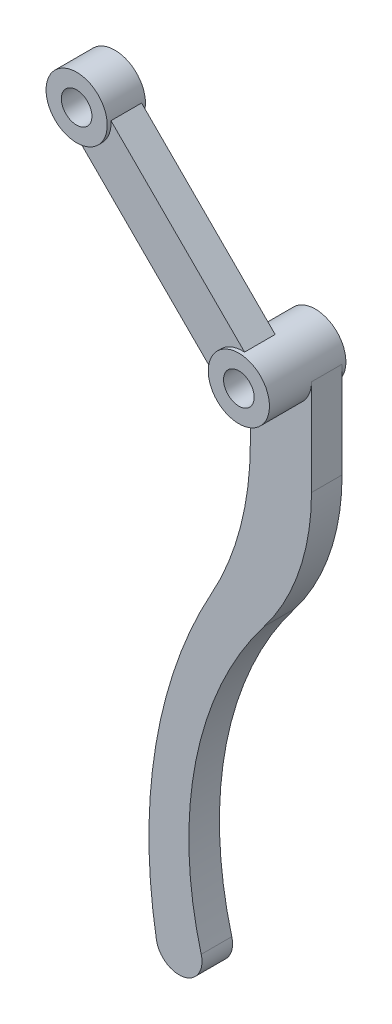
ISO-10303-21;
HEADER;
FILE_DESCRIPTION(('STEP AP214'),'2;1');
FILE_NAME('part.step','',(''),(''),'','','');
FILE_SCHEMA(('AUTOMOTIVE_DESIGN { 1 0 10303 214 1 1 1 1 }'));
ENDSEC;
DATA;
#1=APPLICATION_CONTEXT('core data for automotive mechanical design processes');
#2=APPLICATION_PROTOCOL_DEFINITION('international standard','automotive_design',2000,#1);
#3=PRODUCT_CONTEXT('',#1,'mechanical');
#4=PRODUCT('Part','Part','',(#3));
#5=PRODUCT_RELATED_PRODUCT_CATEGORY('part','',(#4));
#6=PRODUCT_DEFINITION_FORMATION('','',#4);
#7=PRODUCT_DEFINITION_CONTEXT('part definition',#1,'design');
#8=PRODUCT_DEFINITION('design','',#6,#7);
#9=PRODUCT_DEFINITION_SHAPE('','',#8);
#10=(LENGTH_UNIT() NAMED_UNIT(*) SI_UNIT(.MILLI.,.METRE.));
#11=(NAMED_UNIT(*) PLANE_ANGLE_UNIT() SI_UNIT($,.RADIAN.));
#12=(NAMED_UNIT(*) SI_UNIT($,.STERADIAN.) SOLID_ANGLE_UNIT());
#13=UNCERTAINTY_MEASURE_WITH_UNIT(LENGTH_MEASURE(1.E-05),#10,'distance_accuracy_value','');
#14=(GEOMETRIC_REPRESENTATION_CONTEXT(3) GLOBAL_UNCERTAINTY_ASSIGNED_CONTEXT((#13)) GLOBAL_UNIT_ASSIGNED_CONTEXT((#10,
#11,#12)) REPRESENTATION_CONTEXT('',''));
#15=CARTESIAN_POINT('',(0.,0.,0.));
#16=DIRECTION('',(0.,0.,1.));
#17=DIRECTION('',(1.,0.,0.));
#18=AXIS2_PLACEMENT_3D('',#15,#16,#17);
#19=CARTESIAN_POINT('',(0.,0.,10.));
#20=DIRECTION('',(0.,0.,-1.));
#21=DIRECTION('',(-1.,0.,0.));
#22=AXIS2_PLACEMENT_3D('',#19,#20,#21);
#23=CYLINDRICAL_SURFACE('',#22,8.);
#24=CARTESIAN_POINT('',(0.,0.,-10.));
#25=DIRECTION('',(0.,0.,1.));
#26=DIRECTION('',(1.,0.,0.));
#27=AXIS2_PLACEMENT_3D('',#24,#25,#26);
#28=CIRCLE('',#27,8.);
#29=CARTESIAN_POINT('',(8.,0.,-10.));
#30=VERTEX_POINT('',#29);
#31=EDGE_CURVE('E198',#30,#30,#28,.T.);
#32=ORIENTED_EDGE('',*,*,#31,.T.);
#33=EDGE_LOOP('',(#32));
#34=FACE_BOUND('',#33,.T.);
#35=CARTESIAN_POINT('',(0.,0.,10.));
#36=DIRECTION('',(0.,0.,1.));
#37=DIRECTION('',(1.,0.,0.));
#38=AXIS2_PLACEMENT_3D('',#35,#36,#37);
#39=CIRCLE('',#38,8.);
#40=CARTESIAN_POINT('',(8.,0.,10.));
#41=VERTEX_POINT('',#40);
#42=EDGE_CURVE('E11',#41,#41,#39,.T.);
#43=ORIENTED_EDGE('',*,*,#42,.F.);
#44=EDGE_LOOP('',(#43));
#45=FACE_BOUND('',#44,.T.);
#46=DIRECTION('',(0.,0.,-1.));
#47=VECTOR('',#46,1.);
#48=CARTESIAN_POINT('',(0.500983300345398,7.98429807389322,9.));
#49=LINE('',#48,#47);
#50=CARTESIAN_POINT('',(0.500983300345397,7.98429807389322,9.));
#51=VERTEX_POINT('',#50);
#52=CARTESIAN_POINT('',(0.500983300345398,7.98429807389322,0.999999999999999));
#53=VERTEX_POINT('',#52);
#54=EDGE_CURVE('E57',#51,#53,#49,.T.);
#55=ORIENTED_EDGE('',*,*,#54,.F.);
#56=CARTESIAN_POINT('',(0.,0.,9.));
#57=DIRECTION('',(0.,0.,-1.));
#58=DIRECTION('',(1.,0.,0.));
#59=AXIS2_PLACEMENT_3D('',#56,#57,#58);
#60=CIRCLE('',#59,8.);
#61=CARTESIAN_POINT('',(-7.98429807389323,-0.500983300345278,9.));
#62=VERTEX_POINT('',#61);
#63=EDGE_CURVE('E214',#62,#51,#60,.T.);
#64=ORIENTED_EDGE('',*,*,#63,.F.);
#65=DIRECTION('',(0.,0.,-1.));
#66=VECTOR('',#65,1.);
#67=CARTESIAN_POINT('',(-7.98429807389323,-0.500983300345287,9.));
#68=LINE('',#67,#66);
#69=CARTESIAN_POINT('',(-7.98429807389323,-0.500983300345287,1.));
#70=VERTEX_POINT('',#69);
#71=EDGE_CURVE('E225',#62,#70,#68,.T.);
#72=ORIENTED_EDGE('',*,*,#71,.T.);
#73=CARTESIAN_POINT('',(0.,0.,1.));
#74=DIRECTION('',(0.,0.,-1.));
#75=DIRECTION('',(1.,0.,0.));
#76=AXIS2_PLACEMENT_3D('',#73,#74,#75);
#77=CIRCLE('',#76,8.);
#78=EDGE_CURVE('E211',#70,#53,#77,.T.);
#79=ORIENTED_EDGE('',*,*,#78,.T.);
#80=EDGE_LOOP('',(#55,#64,#72,#79));
#81=FACE_BOUND('',#80,.T.);
#82=CARTESIAN_POINT('',(0.,0.,-9.));
#83=DIRECTION('',(0.,0.,-1.));
#84=DIRECTION('',(1.,0.,0.));
#85=AXIS2_PLACEMENT_3D('',#82,#83,#84);
#86=CIRCLE('',#85,8.);
#87=CARTESIAN_POINT('',(8.,0.,-9.));
#88=VERTEX_POINT('',#87);
#89=CARTESIAN_POINT('',(-8.,0.,-9.));
#90=VERTEX_POINT('',#89);
#91=EDGE_CURVE('E141',#88,#90,#86,.T.);
#92=ORIENTED_EDGE('',*,*,#91,.T.);
#93=DIRECTION('',(0.,0.,1.));
#94=VECTOR('',#93,1.);
#95=CARTESIAN_POINT('',(-8.,0.,-9.));
#96=LINE('',#95,#94);
#97=CARTESIAN_POINT('',(-8.,0.,-1.));
#98=VERTEX_POINT('',#97);
#99=EDGE_CURVE('E125',#90,#98,#96,.T.);
#100=ORIENTED_EDGE('',*,*,#99,.T.);
#101=CARTESIAN_POINT('',(0.,0.,-1.));
#102=DIRECTION('',(0.,0.,-1.));
#103=DIRECTION('',(1.,0.,0.));
#104=AXIS2_PLACEMENT_3D('',#101,#102,#103);
#105=CIRCLE('',#104,8.);
#106=CARTESIAN_POINT('',(8.,0.,-0.999999999999999));
#107=VERTEX_POINT('',#106);
#108=EDGE_CURVE('E167',#107,#98,#105,.T.);
#109=ORIENTED_EDGE('',*,*,#108,.F.);
#110=DIRECTION('',(0.,0.,1.));
#111=VECTOR('',#110,1.);
#112=CARTESIAN_POINT('',(8.,0.,-9.));
#113=LINE('',#112,#111);
#114=EDGE_CURVE('E148',#88,#107,#113,.T.);
#115=ORIENTED_EDGE('',*,*,#114,.F.);
#116=EDGE_LOOP('',(#92,#100,#109,#115));
#117=FACE_BOUND('',#116,.T.);
#118=ADVANCED_FACE('F35',(#34,#45,#81,#117),#23,.T.);
#119=CARTESIAN_POINT('',(0.,0.,10.));
#120=DIRECTION('',(0.,0.,1.));
#121=DIRECTION('',(1.,0.,0.));
#122=AXIS2_PLACEMENT_3D('',#119,#120,#121);
#123=PLANE('',#122);
#124=ORIENTED_EDGE('',*,*,#42,.T.);
#125=EDGE_LOOP('',(#124));
#126=FACE_BOUND('',#125,.T.);
#127=CARTESIAN_POINT('',(0.,0.,10.));
#128=DIRECTION('',(0.,0.,1.));
#129=DIRECTION('',(1.,0.,0.));
#130=AXIS2_PLACEMENT_3D('',#127,#128,#129);
#131=CIRCLE('',#130,4.);
#132=CARTESIAN_POINT('',(4.,0.,10.));
#133=VERTEX_POINT('',#132);
#134=EDGE_CURVE('E42',#133,#133,#131,.T.);
#135=ORIENTED_EDGE('',*,*,#134,.F.);
#136=EDGE_LOOP('',(#135));
#137=FACE_BOUND('',#136,.T.);
#138=ADVANCED_FACE('F247',(#126,#137),#123,.T.);
#139=CARTESIAN_POINT('',(0.,0.,10.));
#140=DIRECTION('',(0.,0.,-1.));
#141=DIRECTION('',(-1.,0.,0.));
#142=AXIS2_PLACEMENT_3D('',#139,#140,#141);
#143=CYLINDRICAL_SURFACE('',#142,4.);
#144=ORIENTED_EDGE('',*,*,#134,.T.);
#145=EDGE_LOOP('',(#144));
#146=FACE_BOUND('',#145,.T.);
#147=CARTESIAN_POINT('',(0.,0.,-10.));
#148=DIRECTION('',(0.,0.,1.));
#149=DIRECTION('',(1.,0.,0.));
#150=AXIS2_PLACEMENT_3D('',#147,#148,#149);
#151=CIRCLE('',#150,4.);
#152=CARTESIAN_POINT('',(4.,0.,-10.));
#153=VERTEX_POINT('',#152);
#154=EDGE_CURVE('E184',#153,#153,#151,.T.);
#155=ORIENTED_EDGE('',*,*,#154,.F.);
#156=EDGE_LOOP('',(#155));
#157=FACE_BOUND('',#156,.T.);
#158=ADVANCED_FACE('F244',(#146,#157),#143,.F.);
#159=CARTESIAN_POINT('',(-34.4421087972994,42.9273901715384,9.));
#160=DIRECTION('',(-0.707106781186551,-0.707106781186544,0.));
#161=DIRECTION('',(0.707106781186544,-0.707106781186551,0.));
#162=AXIS2_PLACEMENT_3D('',#159,#160,#161);
#163=PLANE('',#162);
#164=DIRECTION('',(-0.707106781186544,0.707106781186551,0.));
#165=VECTOR('',#164,1.);
#166=CARTESIAN_POINT('',(-34.4421087972994,42.9273901715384,1.));
#167=LINE('',#166,#165);
#168=CARTESIAN_POINT('',(-34.4421087972994,42.9273901715384,1.));
#169=VERTEX_POINT('',#168);
#170=EDGE_CURVE('E227',#53,#169,#167,.T.);
#171=ORIENTED_EDGE('',*,*,#170,.T.);
#172=DIRECTION('',(0.,0.,-1.));
#173=VECTOR('',#172,1.);
#174=CARTESIAN_POINT('',(-34.4421087972994,42.9273901715384,9.));
#175=LINE('',#174,#173);
#176=CARTESIAN_POINT('',(-34.4421087972994,42.9273901715384,9.));
#177=VERTEX_POINT('',#176);
#178=EDGE_CURVE('E238',#177,#169,#175,.T.);
#179=ORIENTED_EDGE('',*,*,#178,.F.);
#180=DIRECTION('',(-0.707106781186544,0.707106781186551,0.));
#181=VECTOR('',#180,1.);
#182=CARTESIAN_POINT('',(-34.4421087972994,42.9273901715384,9.));
#183=LINE('',#182,#181);
#184=EDGE_CURVE('E217',#51,#177,#183,.T.);
#185=ORIENTED_EDGE('',*,*,#184,.F.);
#186=ORIENTED_EDGE('',*,*,#54,.T.);
#187=EDGE_LOOP('',(#171,#179,#185,#186));
#188=FACE_BOUND('',#187,.T.);
#189=ADVANCED_FACE('F254',(#188),#163,.F.);
#190=CARTESIAN_POINT('',(-42.927390171538,34.4421087972999,9.));
#191=DIRECTION('',(0.707106781186551,0.707106781186544,0.));
#192=DIRECTION('',(-0.707106781186544,0.707106781186551,0.));
#193=AXIS2_PLACEMENT_3D('',#190,#191,#192);
#194=PLANE('',#193);
#195=DIRECTION('',(0.707106781186544,-0.707106781186551,0.));
#196=VECTOR('',#195,1.);
#197=CARTESIAN_POINT('',(-42.927390171538,34.4421087972999,1.));
#198=LINE('',#197,#196);
#199=CARTESIAN_POINT('',(-42.927390171538,34.4421087972999,0.999999999999999));
#200=VERTEX_POINT('',#199);
#201=EDGE_CURVE('E218',#200,#70,#198,.T.);
#202=ORIENTED_EDGE('',*,*,#201,.T.);
#203=ORIENTED_EDGE('',*,*,#71,.F.);
#204=DIRECTION('',(0.707106781186544,-0.707106781186551,0.));
#205=VECTOR('',#204,1.);
#206=CARTESIAN_POINT('',(-42.927390171538,34.4421087972999,9.));
#207=LINE('',#206,#205);
#208=CARTESIAN_POINT('',(-42.927390171538,34.4421087972999,9.));
#209=VERTEX_POINT('',#208);
#210=EDGE_CURVE('E222',#209,#62,#207,.T.);
#211=ORIENTED_EDGE('',*,*,#210,.F.);
#212=DIRECTION('',(0.,0.,-1.));
#213=VECTOR('',#212,1.);
#214=CARTESIAN_POINT('',(-42.927390171538,34.4421087972999,9.));
#215=LINE('',#214,#213);
#216=EDGE_CURVE('E235',#209,#200,#215,.T.);
#217=ORIENTED_EDGE('',*,*,#216,.T.);
#218=EDGE_LOOP('',(#202,#203,#211,#217));
#219=FACE_BOUND('',#218,.T.);
#220=ADVANCED_FACE('F260',(#219),#194,.F.);
#221=CARTESIAN_POINT('',(0.,0.,9.));
#222=DIRECTION('',(0.,0.,1.));
#223=DIRECTION('',(1.,0.,0.));
#224=AXIS2_PLACEMENT_3D('',#221,#222,#223);
#225=PLANE('',#224);
#226=ORIENTED_EDGE('',*,*,#63,.T.);
#227=ORIENTED_EDGE('',*,*,#184,.T.);
#228=CARTESIAN_POINT('',(-42.4264068711926,42.4264068711931,9.));
#229=DIRECTION('',(0.,0.,-1.));
#230=DIRECTION('',(1.,0.,0.));
#231=AXIS2_PLACEMENT_3D('',#228,#229,#230);
#232=CIRCLE('',#231,7.99999999999999);
#233=EDGE_CURVE('E220',#177,#209,#232,.T.);
#234=ORIENTED_EDGE('',*,*,#233,.T.);
#235=ORIENTED_EDGE('',*,*,#210,.T.);
#236=EDGE_LOOP('',(#226,#227,#234,#235));
#237=FACE_BOUND('',#236,.T.);
#238=ADVANCED_FACE('F264',(#237),#225,.T.);
#239=CARTESIAN_POINT('',(0.,0.,1.));
#240=DIRECTION('',(0.,0.,1.));
#241=DIRECTION('',(1.,0.,0.));
#242=AXIS2_PLACEMENT_3D('',#239,#240,#241);
#243=PLANE('',#242);
#244=ORIENTED_EDGE('',*,*,#78,.F.);
#245=ORIENTED_EDGE('',*,*,#201,.F.);
#246=CARTESIAN_POINT('',(-42.4264068711926,42.4264068711931,1.));
#247=DIRECTION('',(0.,0.,-1.));
#248=DIRECTION('',(1.,0.,0.));
#249=AXIS2_PLACEMENT_3D('',#246,#247,#248);
#250=CIRCLE('',#249,7.99999999999999);
#251=EDGE_CURVE('E229',#169,#200,#250,.T.);
#252=ORIENTED_EDGE('',*,*,#251,.F.);
#253=ORIENTED_EDGE('',*,*,#170,.F.);
#254=EDGE_LOOP('',(#244,#245,#252,#253));
#255=FACE_BOUND('',#254,.T.);
#256=ADVANCED_FACE('F266',(#255),#243,.F.);
#257=CARTESIAN_POINT('',(-42.4264068711926,42.4264068711931,10.));
#258=DIRECTION('',(0.,0.,1.));
#259=DIRECTION('',(1.,0.,0.));
#260=AXIS2_PLACEMENT_3D('',#257,#258,#259);
#261=PLANE('',#260);
#262=CARTESIAN_POINT('',(-42.4264068711926,42.4264068711931,10.));
#263=DIRECTION('',(0.,0.,1.));
#264=DIRECTION('',(1.,0.,0.));
#265=AXIS2_PLACEMENT_3D('',#262,#263,#264);
#266=CIRCLE('',#265,7.99999999999999);
#267=CARTESIAN_POINT('',(-34.4264068711926,42.4264068711931,10.));
#268=VERTEX_POINT('',#267);
#269=EDGE_CURVE('E208',#268,#268,#266,.T.);
#270=ORIENTED_EDGE('',*,*,#269,.T.);
#271=EDGE_LOOP('',(#270));
#272=FACE_BOUND('',#271,.T.);
#273=CARTESIAN_POINT('',(-42.4264068711926,42.4264068711931,10.));
#274=DIRECTION('',(0.,0.,1.));
#275=DIRECTION('',(1.,0.,0.));
#276=AXIS2_PLACEMENT_3D('',#273,#274,#275);
#277=CIRCLE('',#276,4.);
#278=CARTESIAN_POINT('',(-38.4264068711926,42.4264068711931,10.));
#279=VERTEX_POINT('',#278);
#280=EDGE_CURVE('E202',#279,#279,#277,.T.);
#281=ORIENTED_EDGE('',*,*,#280,.F.);
#282=EDGE_LOOP('',(#281));
#283=FACE_BOUND('',#282,.T.);
#284=ADVANCED_FACE('F269',(#272,#283),#261,.T.);
#285=CARTESIAN_POINT('',(-42.4264068711926,42.4264068711931,0.));
#286=DIRECTION('',(0.,0.,1.));
#287=DIRECTION('',(1.,0.,0.));
#288=AXIS2_PLACEMENT_3D('',#285,#286,#287);
#289=PLANE('',#288);
#290=CARTESIAN_POINT('',(-42.4264068711926,42.4264068711931,0.));
#291=DIRECTION('',(0.,0.,1.));
#292=DIRECTION('',(1.,0.,0.));
#293=AXIS2_PLACEMENT_3D('',#290,#291,#292);
#294=CIRCLE('',#293,7.99999999999999);
#295=CARTESIAN_POINT('',(-34.4264068711926,42.4264068711931,0.));
#296=VERTEX_POINT('',#295);
#297=EDGE_CURVE('E205',#296,#296,#294,.T.);
#298=ORIENTED_EDGE('',*,*,#297,.F.);
#299=EDGE_LOOP('',(#298));
#300=FACE_BOUND('',#299,.T.);
#301=CARTESIAN_POINT('',(-42.4264068711926,42.4264068711931,0.));
#302=DIRECTION('',(0.,0.,1.));
#303=DIRECTION('',(1.,0.,0.));
#304=AXIS2_PLACEMENT_3D('',#301,#302,#303);
#305=CIRCLE('',#304,4.);
#306=CARTESIAN_POINT('',(-38.4264068711926,42.4264068711931,0.));
#307=VERTEX_POINT('',#306);
#308=EDGE_CURVE('E201',#307,#307,#305,.T.);
#309=ORIENTED_EDGE('',*,*,#308,.T.);
#310=EDGE_LOOP('',(#309));
#311=FACE_BOUND('',#310,.T.);
#312=ADVANCED_FACE('F278',(#300,#311),#289,.F.);
#313=CARTESIAN_POINT('',(-42.4264068711926,42.4264068711931,10.));
#314=DIRECTION('',(0.,0.,-1.));
#315=DIRECTION('',(-1.,0.,0.));
#316=AXIS2_PLACEMENT_3D('',#313,#314,#315);
#317=CYLINDRICAL_SURFACE('',#316,7.99999999999999);
#318=ORIENTED_EDGE('',*,*,#233,.F.);
#319=ORIENTED_EDGE('',*,*,#178,.T.);
#320=ORIENTED_EDGE('',*,*,#251,.T.);
#321=ORIENTED_EDGE('',*,*,#216,.F.);
#322=EDGE_LOOP('',(#318,#319,#320,#321));
#323=FACE_BOUND('',#322,.T.);
#324=ORIENTED_EDGE('',*,*,#269,.F.);
#325=EDGE_LOOP('',(#324));
#326=FACE_BOUND('',#325,.T.);
#327=ORIENTED_EDGE('',*,*,#297,.T.);
#328=EDGE_LOOP('',(#327));
#329=FACE_BOUND('',#328,.T.);
#330=ADVANCED_FACE('F274',(#323,#326,#329),#317,.T.);
#331=CARTESIAN_POINT('',(-42.4264068711926,42.4264068711931,10.));
#332=DIRECTION('',(0.,0.,-1.));
#333=DIRECTION('',(-1.,0.,0.));
#334=AXIS2_PLACEMENT_3D('',#331,#332,#333);
#335=CYLINDRICAL_SURFACE('',#334,4.);
#336=ORIENTED_EDGE('',*,*,#280,.T.);
#337=EDGE_LOOP('',(#336));
#338=FACE_BOUND('',#337,.T.);
#339=ORIENTED_EDGE('',*,*,#308,.F.);
#340=EDGE_LOOP('',(#339));
#341=FACE_BOUND('',#340,.T.);
#342=ADVANCED_FACE('F277',(#338,#341),#335,.F.);
#343=CARTESIAN_POINT('',(0.,0.,-10.));
#344=DIRECTION('',(0.,0.,1.));
#345=DIRECTION('',(1.,0.,0.));
#346=AXIS2_PLACEMENT_3D('',#343,#344,#345);
#347=PLANE('',#346);
#348=ORIENTED_EDGE('',*,*,#154,.T.);
#349=EDGE_LOOP('',(#348));
#350=FACE_BOUND('',#349,.T.);
#351=ORIENTED_EDGE('',*,*,#31,.F.);
#352=EDGE_LOOP('',(#351));
#353=FACE_BOUND('',#352,.T.);
#354=ADVANCED_FACE('F288',(#350,#353),#347,.F.);
#355=CARTESIAN_POINT('',(8.,0.,-9.));
#356=DIRECTION('',(1.,0.,0.));
#357=DIRECTION('',(0.,1.,0.));
#358=AXIS2_PLACEMENT_3D('',#355,#356,#357);
#359=PLANE('',#358);
#360=DIRECTION('',(0.,1.,0.));
#361=VECTOR('',#360,1.);
#362=CARTESIAN_POINT('',(8.,0.,-1.));
#363=LINE('',#362,#361);
#364=CARTESIAN_POINT('',(8.00000000000001,-25.0755711717181,-1.));
#365=VERTEX_POINT('',#364);
#366=EDGE_CURVE('E49',#365,#107,#363,.T.);
#367=ORIENTED_EDGE('',*,*,#366,.F.);
#368=DIRECTION('',(0.,0.,1.));
#369=VECTOR('',#368,1.);
#370=CARTESIAN_POINT('',(8.00000000000001,-25.0755711717181,-9.));
#371=LINE('',#370,#369);
#372=CARTESIAN_POINT('',(8.00000000000001,-25.0755711717181,-9.));
#373=VERTEX_POINT('',#372);
#374=EDGE_CURVE('E185',#373,#365,#371,.T.);
#375=ORIENTED_EDGE('',*,*,#374,.F.);
#376=DIRECTION('',(0.,1.,0.));
#377=VECTOR('',#376,1.);
#378=CARTESIAN_POINT('',(8.,0.,-9.));
#379=LINE('',#378,#377);
#380=EDGE_CURVE('E135',#373,#88,#379,.T.);
#381=ORIENTED_EDGE('',*,*,#380,.T.);
#382=ORIENTED_EDGE('',*,*,#114,.T.);
#383=EDGE_LOOP('',(#367,#375,#381,#382));
#384=FACE_BOUND('',#383,.T.);
#385=ADVANCED_FACE('F292',(#384),#359,.T.);
#386=CARTESIAN_POINT('',(-52.,-25.0755711717181,-9.));
#387=DIRECTION('',(0.,0.,1.));
#388=DIRECTION('',(1.,0.,0.));
#389=AXIS2_PLACEMENT_3D('',#386,#387,#388);
#390=CYLINDRICAL_SURFACE('',#389,60.);
#391=CARTESIAN_POINT('',(-52.,-25.0755711717181,-1.));
#392=DIRECTION('',(0.,0.,1.));
#393=DIRECTION('',(1.,0.,0.));
#394=AXIS2_PLACEMENT_3D('',#391,#392,#393);
#395=CIRCLE('',#394,60.);
#396=CARTESIAN_POINT('',(-4.41853557156731,-61.6269629762143,-1.));
#397=VERTEX_POINT('',#396);
#398=EDGE_CURVE('E150',#397,#365,#395,.T.);
#399=ORIENTED_EDGE('',*,*,#398,.F.);
#400=DIRECTION('',(0.,0.,1.));
#401=VECTOR('',#400,1.);
#402=CARTESIAN_POINT('',(-4.41853557156731,-61.6269629762143,-9.));
#403=LINE('',#402,#401);
#404=CARTESIAN_POINT('',(-4.41853557156731,-61.6269629762143,-9.));
#405=VERTEX_POINT('',#404);
#406=EDGE_CURVE('E187',#405,#397,#403,.T.);
#407=ORIENTED_EDGE('',*,*,#406,.F.);
#408=CARTESIAN_POINT('',(-52.,-25.0755711717181,-9.));
#409=DIRECTION('',(0.,0.,1.));
#410=DIRECTION('',(1.,0.,0.));
#411=AXIS2_PLACEMENT_3D('',#408,#409,#410);
#412=CIRCLE('',#411,60.);
#413=EDGE_CURVE('E163',#405,#373,#412,.T.);
#414=ORIENTED_EDGE('',*,*,#413,.T.);
#415=ORIENTED_EDGE('',*,*,#374,.T.);
#416=EDGE_LOOP('',(#399,#407,#414,#415));
#417=FACE_BOUND('',#416,.T.);
#418=ADVANCED_FACE('F311',(#417),#390,.T.);
#419=CARTESIAN_POINT('',(70.9187831067845,-119.5,-9.));
#420=DIRECTION('',(0.,0.,1.));
#421=DIRECTION('',(1.,0.,0.));
#422=AXIS2_PLACEMENT_3D('',#419,#420,#421);
#423=CYLINDRICAL_SURFACE('',#422,95.);
#424=CARTESIAN_POINT('',(70.9187831067845,-119.5,-1.));
#425=DIRECTION('',(0.,0.,-1.));
#426=DIRECTION('',(-1.,0.,0.));
#427=AXIS2_PLACEMENT_3D('',#424,#425,#426);
#428=CIRCLE('',#427,95.);
#429=CARTESIAN_POINT('',(-20.8441703906771,-144.087809284739,-1.));
#430=VERTEX_POINT('',#429);
#431=EDGE_CURVE('E179',#430,#397,#428,.T.);
#432=ORIENTED_EDGE('',*,*,#431,.F.);
#433=DIRECTION('',(0.,0.,1.));
#434=VECTOR('',#433,1.);
#435=CARTESIAN_POINT('',(-20.8441703906771,-144.087809284739,-9.));
#436=LINE('',#435,#434);
#437=CARTESIAN_POINT('',(-20.8441703906771,-144.087809284739,-9.));
#438=VERTEX_POINT('',#437);
#439=EDGE_CURVE('E189',#438,#430,#436,.T.);
#440=ORIENTED_EDGE('',*,*,#439,.F.);
#441=CARTESIAN_POINT('',(70.9187831067845,-119.5,-9.));
#442=DIRECTION('',(0.,0.,-1.));
#443=DIRECTION('',(-1.,0.,0.));
#444=AXIS2_PLACEMENT_3D('',#441,#442,#443);
#445=CIRCLE('',#444,95.);
#446=EDGE_CURVE('E160',#438,#405,#445,.T.);
#447=ORIENTED_EDGE('',*,*,#446,.T.);
#448=ORIENTED_EDGE('',*,*,#406,.T.);
#449=EDGE_LOOP('',(#432,#440,#447,#448));
#450=FACE_BOUND('',#449,.T.);
#451=ADVANCED_FACE('F307',(#450),#423,.F.);
#452=CARTESIAN_POINT('',(-26.6397253484115,-145.640723555354,-9.));
#453=DIRECTION('',(0.,0.,1.));
#454=DIRECTION('',(1.,0.,0.));
#455=AXIS2_PLACEMENT_3D('',#452,#453,#454);
#456=CYLINDRICAL_SURFACE('',#455,5.99999999999999);
#457=CARTESIAN_POINT('',(-26.6397253484115,-145.640723555354,-1.));
#458=DIRECTION('',(0.,0.,1.));
#459=DIRECTION('',(1.,0.,0.));
#460=AXIS2_PLACEMENT_3D('',#457,#458,#459);
#461=CIRCLE('',#460,5.99999999999999);
#462=CARTESIAN_POINT('',(-32.5488978176282,-146.680762366674,-1.));
#463=VERTEX_POINT('',#462);
#464=EDGE_CURVE('E176',#463,#430,#461,.T.);
#465=ORIENTED_EDGE('',*,*,#464,.F.);
#466=DIRECTION('',(0.,0.,1.));
#467=VECTOR('',#466,1.);
#468=CARTESIAN_POINT('',(-32.5488978176282,-146.680762366674,-9.));
#469=LINE('',#468,#467);
#470=CARTESIAN_POINT('',(-32.5488978176282,-146.680762366674,-9.));
#471=VERTEX_POINT('',#470);
#472=EDGE_CURVE('E191',#471,#463,#469,.T.);
#473=ORIENTED_EDGE('',*,*,#472,.F.);
#474=CARTESIAN_POINT('',(-26.6397253484115,-145.640723555354,-9.));
#475=DIRECTION('',(0.,0.,1.));
#476=DIRECTION('',(1.,0.,0.));
#477=AXIS2_PLACEMENT_3D('',#474,#475,#476);
#478=CIRCLE('',#477,5.99999999999999);
#479=EDGE_CURVE('E157',#471,#438,#478,.T.);
#480=ORIENTED_EDGE('',*,*,#479,.T.);
#481=ORIENTED_EDGE('',*,*,#439,.T.);
#482=EDGE_LOOP('',(#465,#473,#480,#481));
#483=FACE_BOUND('',#482,.T.);
#484=ADVANCED_FACE('F303',(#483),#456,.T.);
#485=CARTESIAN_POINT('',(95.4831723487332,-124.14658812141,-9.));
#486=DIRECTION('',(0.,0.,1.));
#487=DIRECTION('',(1.,0.,0.));
#488=AXIS2_PLACEMENT_3D('',#485,#486,#487);
#489=CYLINDRICAL_SURFACE('',#488,130.);
#490=CARTESIAN_POINT('',(95.4831723487332,-124.14658812141,-1.));
#491=DIRECTION('',(0.,0.,1.));
#492=DIRECTION('',(1.,0.,0.));
#493=AXIS2_PLACEMENT_3D('',#490,#491,#492);
#494=CIRCLE('',#493,130.);
#495=CARTESIAN_POINT('',(-18.101648629054,-60.9129859510135,-1.));
#496=VERTEX_POINT('',#495);
#497=EDGE_CURVE('E173',#496,#463,#494,.T.);
#498=ORIENTED_EDGE('',*,*,#497,.F.);
#499=DIRECTION('',(0.,0.,1.));
#500=VECTOR('',#499,1.);
#501=CARTESIAN_POINT('',(-18.101648629054,-60.9129859510135,-9.));
#502=LINE('',#501,#500);
#503=CARTESIAN_POINT('',(-18.101648629054,-60.9129859510135,-9.));
#504=VERTEX_POINT('',#503);
#505=EDGE_CURVE('E193',#504,#496,#502,.T.);
#506=ORIENTED_EDGE('',*,*,#505,.F.);
#507=CARTESIAN_POINT('',(95.4831723487332,-124.14658812141,-9.));
#508=DIRECTION('',(0.,0.,1.));
#509=DIRECTION('',(1.,0.,0.));
#510=AXIS2_PLACEMENT_3D('',#507,#508,#509);
#511=CIRCLE('',#510,130.);
#512=EDGE_CURVE('E154',#504,#471,#511,.T.);
#513=ORIENTED_EDGE('',*,*,#512,.T.);
#514=ORIENTED_EDGE('',*,*,#472,.T.);
#515=EDGE_LOOP('',(#498,#506,#513,#514));
#516=FACE_BOUND('',#515,.T.);
#517=ADVANCED_FACE('F299',(#516),#489,.T.);
#518=CARTESIAN_POINT('',(-88.,-22.,-9.));
#519=DIRECTION('',(0.,0.,1.));
#520=DIRECTION('',(1.,0.,0.));
#521=AXIS2_PLACEMENT_3D('',#518,#519,#520);
#522=CYLINDRICAL_SURFACE('',#521,80.);
#523=CARTESIAN_POINT('',(-88.,-22.,-1.));
#524=DIRECTION('',(0.,0.,-1.));
#525=DIRECTION('',(-1.,0.,0.));
#526=AXIS2_PLACEMENT_3D('',#523,#524,#525);
#527=CIRCLE('',#526,80.);
#528=CARTESIAN_POINT('',(-8.,-22.,-1.));
#529=VERTEX_POINT('',#528);
#530=EDGE_CURVE('E170',#529,#496,#527,.T.);
#531=ORIENTED_EDGE('',*,*,#530,.F.);
#532=DIRECTION('',(0.,0.,1.));
#533=VECTOR('',#532,1.);
#534=CARTESIAN_POINT('',(-8.,-22.,-9.));
#535=LINE('',#534,#533);
#536=CARTESIAN_POINT('',(-8.,-22.,-9.));
#537=VERTEX_POINT('',#536);
#538=EDGE_CURVE('E134',#537,#529,#535,.T.);
#539=ORIENTED_EDGE('',*,*,#538,.F.);
#540=CARTESIAN_POINT('',(-88.,-22.,-9.));
#541=DIRECTION('',(0.,0.,-1.));
#542=DIRECTION('',(-1.,0.,0.));
#543=AXIS2_PLACEMENT_3D('',#540,#541,#542);
#544=CIRCLE('',#543,80.);
#545=EDGE_CURVE('E145',#537,#504,#544,.T.);
#546=ORIENTED_EDGE('',*,*,#545,.T.);
#547=ORIENTED_EDGE('',*,*,#505,.T.);
#548=EDGE_LOOP('',(#531,#539,#546,#547));
#549=FACE_BOUND('',#548,.T.);
#550=ADVANCED_FACE('F296',(#549),#522,.F.);
#551=CARTESIAN_POINT('',(-8.,0.,-9.));
#552=DIRECTION('',(-1.,0.,0.));
#553=DIRECTION('',(0.,-1.,0.));
#554=AXIS2_PLACEMENT_3D('',#551,#552,#553);
#555=PLANE('',#554);
#556=DIRECTION('',(0.,-1.,0.));
#557=VECTOR('',#556,1.);
#558=CARTESIAN_POINT('',(-8.,0.,-1.));
#559=LINE('',#558,#557);
#560=EDGE_CURVE('E130',#98,#529,#559,.T.);
#561=ORIENTED_EDGE('',*,*,#560,.F.);
#562=ORIENTED_EDGE('',*,*,#99,.F.);
#563=DIRECTION('',(0.,-1.,0.));
#564=VECTOR('',#563,1.);
#565=CARTESIAN_POINT('',(-8.,0.,-9.));
#566=LINE('',#565,#564);
#567=EDGE_CURVE('E128',#90,#537,#566,.T.);
#568=ORIENTED_EDGE('',*,*,#567,.T.);
#569=ORIENTED_EDGE('',*,*,#538,.T.);
#570=EDGE_LOOP('',(#561,#562,#568,#569));
#571=FACE_BOUND('',#570,.T.);
#572=ADVANCED_FACE('F127',(#571),#555,.T.);
#573=CARTESIAN_POINT('',(0.,0.,-9.));
#574=DIRECTION('',(0.,0.,1.));
#575=DIRECTION('',(1.,0.,0.));
#576=AXIS2_PLACEMENT_3D('',#573,#574,#575);
#577=PLANE('',#576);
#578=ORIENTED_EDGE('',*,*,#91,.F.);
#579=ORIENTED_EDGE('',*,*,#380,.F.);
#580=ORIENTED_EDGE('',*,*,#413,.F.);
#581=ORIENTED_EDGE('',*,*,#446,.F.);
#582=ORIENTED_EDGE('',*,*,#479,.F.);
#583=ORIENTED_EDGE('',*,*,#512,.F.);
#584=ORIENTED_EDGE('',*,*,#545,.F.);
#585=ORIENTED_EDGE('',*,*,#567,.F.);
#586=EDGE_LOOP('',(#578,#579,#580,#581,#582,#583,#584,#585));
#587=FACE_BOUND('',#586,.T.);
#588=ADVANCED_FACE('F139',(#587),#577,.F.);
#589=CARTESIAN_POINT('',(0.,0.,-1.));
#590=DIRECTION('',(0.,0.,1.));
#591=DIRECTION('',(1.,0.,0.));
#592=AXIS2_PLACEMENT_3D('',#589,#590,#591);
#593=PLANE('',#592);
#594=ORIENTED_EDGE('',*,*,#108,.T.);
#595=ORIENTED_EDGE('',*,*,#560,.T.);
#596=ORIENTED_EDGE('',*,*,#530,.T.);
#597=ORIENTED_EDGE('',*,*,#497,.T.);
#598=ORIENTED_EDGE('',*,*,#464,.T.);
#599=ORIENTED_EDGE('',*,*,#431,.T.);
#600=ORIENTED_EDGE('',*,*,#398,.T.);
#601=ORIENTED_EDGE('',*,*,#366,.T.);
#602=EDGE_LOOP('',(#594,#595,#596,#597,#598,#599,#600,#601));
#603=FACE_BOUND('',#602,.T.);
#604=ADVANCED_FACE('F319',(#603),#593,.T.);
#605=CLOSED_SHELL('',(#118,#138,#158,#189,#220,#238,#256,#284,#312,#330,#342,#354,#385,#418,
#451,#484,#517,#550,#572,#588,#604));
#606=MANIFOLD_SOLID_BREP('B2',#605);
#607=ADVANCED_BREP_SHAPE_REPRESENTATION('',(#18,#606),#14);
#608=SHAPE_DEFINITION_REPRESENTATION(#9,#607);
ENDSEC;
END-ISO-10303-21;
